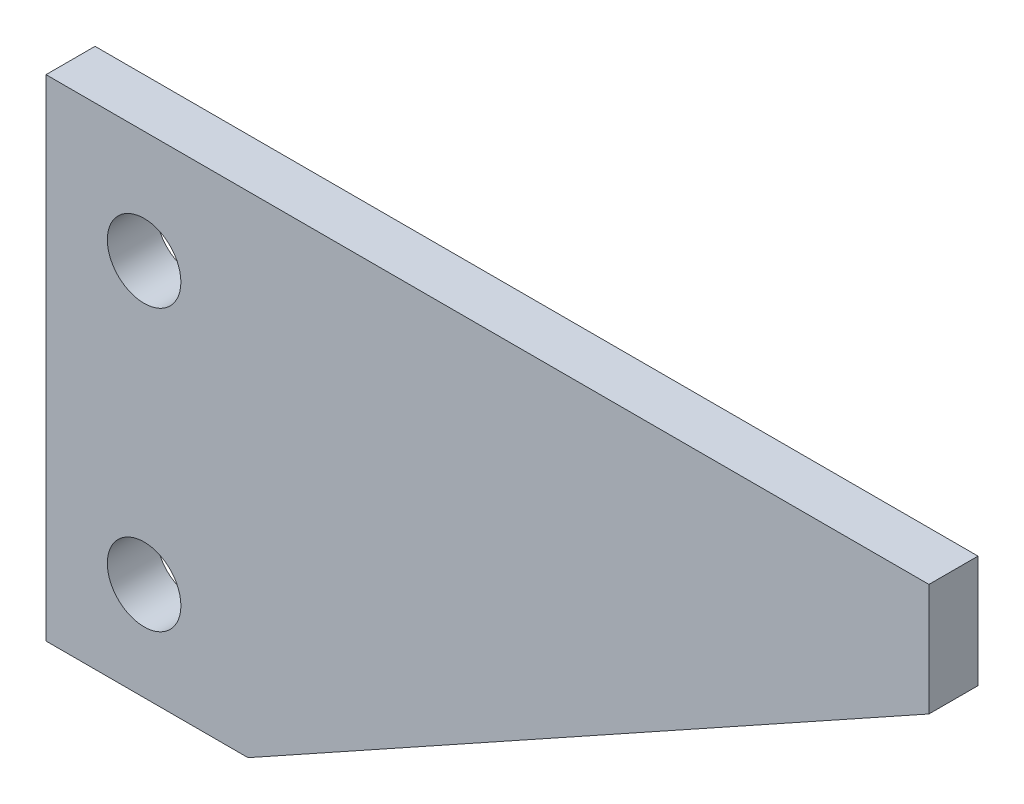
ISO-10303-21;
HEADER;
FILE_DESCRIPTION(('STEP AP214'),'2;1');
FILE_NAME('part.step','',(''),(''),'','','');
FILE_SCHEMA(('AUTOMOTIVE_DESIGN { 1 0 10303 214 1 1 1 1 }'));
ENDSEC;
DATA;
#1=APPLICATION_CONTEXT('core data for automotive mechanical design processes');
#2=APPLICATION_PROTOCOL_DEFINITION('international standard','automotive_design',2000,#1);
#3=PRODUCT_CONTEXT('',#1,'mechanical');
#4=PRODUCT('Part','Part','',(#3));
#5=PRODUCT_RELATED_PRODUCT_CATEGORY('part','',(#4));
#6=PRODUCT_DEFINITION_FORMATION('','',#4);
#7=PRODUCT_DEFINITION_CONTEXT('part definition',#1,'design');
#8=PRODUCT_DEFINITION('design','',#6,#7);
#9=PRODUCT_DEFINITION_SHAPE('','',#8);
#10=(LENGTH_UNIT() NAMED_UNIT(*) SI_UNIT(.MILLI.,.METRE.));
#11=(NAMED_UNIT(*) PLANE_ANGLE_UNIT() SI_UNIT($,.RADIAN.));
#12=(NAMED_UNIT(*) SI_UNIT($,.STERADIAN.) SOLID_ANGLE_UNIT());
#13=UNCERTAINTY_MEASURE_WITH_UNIT(LENGTH_MEASURE(1.E-05),#10,'distance_accuracy_value','');
#14=(GEOMETRIC_REPRESENTATION_CONTEXT(3) GLOBAL_UNCERTAINTY_ASSIGNED_CONTEXT((#13)) GLOBAL_UNIT_ASSIGNED_CONTEXT((#10,
#11,#12)) REPRESENTATION_CONTEXT('',''));
#15=CARTESIAN_POINT('',(0.,0.,0.));
#16=DIRECTION('',(0.,0.,1.));
#17=DIRECTION('',(1.,0.,0.));
#18=AXIS2_PLACEMENT_3D('',#15,#16,#17);
#19=CARTESIAN_POINT('',(90.,27.1208219090685,-5.));
#20=DIRECTION('',(1.,0.,0.));
#21=DIRECTION('',(0.,0.,-1.));
#22=AXIS2_PLACEMENT_3D('',#19,#20,#21);
#23=PLANE('',#22);
#24=DIRECTION('',(0.,0.,1.));
#25=VECTOR('',#24,1.);
#26=CARTESIAN_POINT('',(90.,50.,-5.));
#27=LINE('',#26,#25);
#28=CARTESIAN_POINT('',(90.,50.,-5.));
#29=VERTEX_POINT('',#28);
#30=CARTESIAN_POINT('',(90.,50.,5.));
#31=VERTEX_POINT('',#30);
#32=EDGE_CURVE('E41',#29,#31,#27,.T.);
#33=ORIENTED_EDGE('',*,*,#32,.T.);
#34=DIRECTION('',(0.,1.,0.));
#35=VECTOR('',#34,1.);
#36=CARTESIAN_POINT('',(90.,27.1208219090685,5.));
#37=LINE('',#36,#35);
#38=CARTESIAN_POINT('',(90.,27.1208219090685,5.));
#39=VERTEX_POINT('',#38);
#40=EDGE_CURVE('E84',#39,#31,#37,.T.);
#41=ORIENTED_EDGE('',*,*,#40,.F.);
#42=DIRECTION('',(0.,0.,1.));
#43=VECTOR('',#42,1.);
#44=CARTESIAN_POINT('',(90.,27.1208219090685,-5.));
#45=LINE('',#44,#43);
#46=CARTESIAN_POINT('',(90.,27.1208219090685,-5.));
#47=VERTEX_POINT('',#46);
#48=EDGE_CURVE('E11',#47,#39,#45,.T.);
#49=ORIENTED_EDGE('',*,*,#48,.F.);
#50=DIRECTION('',(0.,1.,0.));
#51=VECTOR('',#50,1.);
#52=CARTESIAN_POINT('',(90.,27.1208219090685,-5.));
#53=LINE('',#52,#51);
#54=EDGE_CURVE('E85',#47,#29,#53,.T.);
#55=ORIENTED_EDGE('',*,*,#54,.T.);
#56=EDGE_LOOP('',(#33,#41,#49,#55));
#57=FACE_BOUND('',#56,.T.);
#58=ADVANCED_FACE('F38',(#57),#23,.T.);
#59=CARTESIAN_POINT('',(-48.8174794358542,-49.9999999999488,-5.));
#60=DIRECTION('',(0.48564293117964,-0.874157276120978,0.));
#61=DIRECTION('',(0.874157276120978,0.48564293117964,0.));
#62=AXIS2_PLACEMENT_3D('',#59,#60,#61);
#63=PLANE('',#62);
#64=ORIENTED_EDGE('',*,*,#48,.T.);
#65=DIRECTION('',(0.874157276120978,0.48564293117964,0.));
#66=VECTOR('',#65,1.);
#67=CARTESIAN_POINT('',(-48.8174794358542,-49.9999999999488,5.));
#68=LINE('',#67,#66);
#69=CARTESIAN_POINT('',(-48.8174794358542,-49.9999999999488,5.));
#70=VERTEX_POINT('',#69);
#71=EDGE_CURVE('E103',#70,#39,#68,.T.);
#72=ORIENTED_EDGE('',*,*,#71,.F.);
#73=DIRECTION('',(0.,0.,1.));
#74=VECTOR('',#73,1.);
#75=CARTESIAN_POINT('',(-48.8174794358542,-49.9999999999488,-5.));
#76=LINE('',#75,#74);
#77=CARTESIAN_POINT('',(-48.8174794358542,-49.9999999999488,-5.));
#78=VERTEX_POINT('',#77);
#79=EDGE_CURVE('E46',#78,#70,#76,.T.);
#80=ORIENTED_EDGE('',*,*,#79,.F.);
#81=DIRECTION('',(0.874157276120978,0.48564293117964,0.));
#82=VECTOR('',#81,1.);
#83=CARTESIAN_POINT('',(-48.8174794358542,-49.9999999999488,-5.));
#84=LINE('',#83,#82);
#85=EDGE_CURVE('E90',#78,#47,#84,.T.);
#86=ORIENTED_EDGE('',*,*,#85,.T.);
#87=EDGE_LOOP('',(#64,#72,#80,#86));
#88=FACE_BOUND('',#87,.T.);
#89=ADVANCED_FACE('F142',(#88),#63,.T.);
#90=CARTESIAN_POINT('',(-90.,-50.,-5.));
#91=DIRECTION('',(1.24228590316177E-12,-1.,0.));
#92=DIRECTION('',(1.,1.24228590316177E-12,0.));
#93=AXIS2_PLACEMENT_3D('',#90,#91,#92);
#94=PLANE('',#93);
#95=ORIENTED_EDGE('',*,*,#79,.T.);
#96=DIRECTION('',(1.,1.24228590316177E-12,0.));
#97=VECTOR('',#96,1.);
#98=CARTESIAN_POINT('',(-90.,-50.,5.));
#99=LINE('',#98,#97);
#100=CARTESIAN_POINT('',(-90.,-50.,5.));
#101=VERTEX_POINT('',#100);
#102=EDGE_CURVE('E112',#101,#70,#99,.T.);
#103=ORIENTED_EDGE('',*,*,#102,.F.);
#104=DIRECTION('',(0.,0.,1.));
#105=VECTOR('',#104,1.);
#106=CARTESIAN_POINT('',(-90.,-50.,-5.));
#107=LINE('',#106,#105);
#108=CARTESIAN_POINT('',(-90.,-50.,-5.));
#109=VERTEX_POINT('',#108);
#110=EDGE_CURVE('E131',#109,#101,#107,.T.);
#111=ORIENTED_EDGE('',*,*,#110,.F.);
#112=DIRECTION('',(1.,1.24228590316177E-12,0.));
#113=VECTOR('',#112,1.);
#114=CARTESIAN_POINT('',(-90.,-50.,-5.));
#115=LINE('',#114,#113);
#116=EDGE_CURVE('E127',#109,#78,#115,.T.);
#117=ORIENTED_EDGE('',*,*,#116,.T.);
#118=EDGE_LOOP('',(#95,#103,#111,#117));
#119=FACE_BOUND('',#118,.T.);
#120=ADVANCED_FACE('F138',(#119),#94,.T.);
#121=CARTESIAN_POINT('',(-90.,-50.,-5.));
#122=DIRECTION('',(-1.,0.,0.));
#123=DIRECTION('',(0.,0.,1.));
#124=AXIS2_PLACEMENT_3D('',#121,#122,#123);
#125=PLANE('',#124);
#126=ORIENTED_EDGE('',*,*,#110,.T.);
#127=DIRECTION('',(0.,-1.,0.));
#128=VECTOR('',#127,1.);
#129=CARTESIAN_POINT('',(-90.,-50.,5.));
#130=LINE('',#129,#128);
#131=CARTESIAN_POINT('',(-90.,50.,5.));
#132=VERTEX_POINT('',#131);
#133=EDGE_CURVE('E97',#132,#101,#130,.T.);
#134=ORIENTED_EDGE('',*,*,#133,.F.);
#135=DIRECTION('',(0.,0.,1.));
#136=VECTOR('',#135,1.);
#137=CARTESIAN_POINT('',(-90.,50.,-5.));
#138=LINE('',#137,#136);
#139=CARTESIAN_POINT('',(-90.,50.,-5.));
#140=VERTEX_POINT('',#139);
#141=EDGE_CURVE('E89',#140,#132,#138,.T.);
#142=ORIENTED_EDGE('',*,*,#141,.F.);
#143=DIRECTION('',(0.,-1.,0.));
#144=VECTOR('',#143,1.);
#145=CARTESIAN_POINT('',(-90.,-50.,-5.));
#146=LINE('',#145,#144);
#147=EDGE_CURVE('E124',#140,#109,#146,.T.);
#148=ORIENTED_EDGE('',*,*,#147,.T.);
#149=EDGE_LOOP('',(#126,#134,#142,#148));
#150=FACE_BOUND('',#149,.T.);
#151=ADVANCED_FACE('F133',(#150),#125,.T.);
#152=CARTESIAN_POINT('',(-90.,50.,-5.));
#153=DIRECTION('',(0.,1.,0.));
#154=DIRECTION('',(0.,0.,1.));
#155=AXIS2_PLACEMENT_3D('',#152,#153,#154);
#156=PLANE('',#155);
#157=ORIENTED_EDGE('',*,*,#141,.T.);
#158=DIRECTION('',(-1.,0.,0.));
#159=VECTOR('',#158,1.);
#160=CARTESIAN_POINT('',(-90.,50.,5.));
#161=LINE('',#160,#159);
#162=EDGE_CURVE('E92',#31,#132,#161,.T.);
#163=ORIENTED_EDGE('',*,*,#162,.F.);
#164=ORIENTED_EDGE('',*,*,#32,.F.);
#165=DIRECTION('',(-1.,0.,0.));
#166=VECTOR('',#165,1.);
#167=CARTESIAN_POINT('',(-90.,50.,-5.));
#168=LINE('',#167,#166);
#169=EDGE_CURVE('E122',#29,#140,#168,.T.);
#170=ORIENTED_EDGE('',*,*,#169,.T.);
#171=EDGE_LOOP('',(#157,#163,#164,#170));
#172=FACE_BOUND('',#171,.T.);
#173=ADVANCED_FACE('F93',(#172),#156,.T.);
#174=CARTESIAN_POINT('',(0.,0.,-5.));
#175=DIRECTION('',(0.,0.,-1.));
#176=DIRECTION('',(-1.,0.,0.));
#177=AXIS2_PLACEMENT_3D('',#174,#175,#176);
#178=PLANE('',#177);
#179=CARTESIAN_POINT('',(-70.,-30.,-5.));
#180=DIRECTION('',(0.,0.,1.));
#181=DIRECTION('',(1.,0.,0.));
#182=AXIS2_PLACEMENT_3D('',#179,#180,#181);
#183=CIRCLE('',#182,7.5);
#184=CARTESIAN_POINT('',(-62.5,-30.,-5.));
#185=VERTEX_POINT('',#184);
#186=EDGE_CURVE('E115',#185,#185,#183,.T.);
#187=ORIENTED_EDGE('',*,*,#186,.T.);
#188=EDGE_LOOP('',(#187));
#189=FACE_BOUND('',#188,.T.);
#190=CARTESIAN_POINT('',(-70.,27.1208219091061,-5.));
#191=DIRECTION('',(0.,0.,1.));
#192=DIRECTION('',(1.,0.,0.));
#193=AXIS2_PLACEMENT_3D('',#190,#191,#192);
#194=CIRCLE('',#193,7.5);
#195=CARTESIAN_POINT('',(-62.5,27.1208219091061,-5.));
#196=VERTEX_POINT('',#195);
#197=EDGE_CURVE('E118',#196,#196,#194,.T.);
#198=ORIENTED_EDGE('',*,*,#197,.T.);
#199=EDGE_LOOP('',(#198));
#200=FACE_BOUND('',#199,.T.);
#201=ORIENTED_EDGE('',*,*,#54,.F.);
#202=ORIENTED_EDGE('',*,*,#85,.F.);
#203=ORIENTED_EDGE('',*,*,#116,.F.);
#204=ORIENTED_EDGE('',*,*,#147,.F.);
#205=ORIENTED_EDGE('',*,*,#169,.F.);
#206=EDGE_LOOP('',(#201,#202,#203,#204,#205));
#207=FACE_BOUND('',#206,.T.);
#208=ADVANCED_FACE('F141',(#189,#200,#207),#178,.T.);
#209=CARTESIAN_POINT('',(-70.,27.1208219091061,-5.));
#210=DIRECTION('',(0.,0.,1.));
#211=DIRECTION('',(1.,0.,0.));
#212=AXIS2_PLACEMENT_3D('',#209,#210,#211);
#213=CYLINDRICAL_SURFACE('',#212,7.5);
#214=ORIENTED_EDGE('',*,*,#197,.F.);
#215=EDGE_LOOP('',(#214));
#216=FACE_BOUND('',#215,.T.);
#217=CARTESIAN_POINT('',(-70.,27.1208219091061,5.));
#218=DIRECTION('',(0.,0.,1.));
#219=DIRECTION('',(1.,0.,0.));
#220=AXIS2_PLACEMENT_3D('',#217,#218,#219);
#221=CIRCLE('',#220,7.5);
#222=CARTESIAN_POINT('',(-62.5,27.1208219091061,5.));
#223=VERTEX_POINT('',#222);
#224=EDGE_CURVE('E104',#223,#223,#221,.T.);
#225=ORIENTED_EDGE('',*,*,#224,.T.);
#226=EDGE_LOOP('',(#225));
#227=FACE_BOUND('',#226,.T.);
#228=ADVANCED_FACE('F158',(#216,#227),#213,.F.);
#229=CARTESIAN_POINT('',(-70.,-30.,-5.));
#230=DIRECTION('',(0.,0.,1.));
#231=DIRECTION('',(1.,0.,0.));
#232=AXIS2_PLACEMENT_3D('',#229,#230,#231);
#233=CYLINDRICAL_SURFACE('',#232,7.5);
#234=ORIENTED_EDGE('',*,*,#186,.F.);
#235=EDGE_LOOP('',(#234));
#236=FACE_BOUND('',#235,.T.);
#237=CARTESIAN_POINT('',(-70.,-30.,5.));
#238=DIRECTION('',(0.,0.,1.));
#239=DIRECTION('',(1.,0.,0.));
#240=AXIS2_PLACEMENT_3D('',#237,#238,#239);
#241=CIRCLE('',#240,7.5);
#242=CARTESIAN_POINT('',(-62.5,-30.,5.));
#243=VERTEX_POINT('',#242);
#244=EDGE_CURVE('E107',#243,#243,#241,.T.);
#245=ORIENTED_EDGE('',*,*,#244,.T.);
#246=EDGE_LOOP('',(#245));
#247=FACE_BOUND('',#246,.T.);
#248=ADVANCED_FACE('F163',(#236,#247),#233,.F.);
#249=CARTESIAN_POINT('',(0.,0.,5.));
#250=DIRECTION('',(0.,0.,-1.));
#251=DIRECTION('',(-1.,0.,0.));
#252=AXIS2_PLACEMENT_3D('',#249,#250,#251);
#253=PLANE('',#252);
#254=ORIENTED_EDGE('',*,*,#40,.T.);
#255=ORIENTED_EDGE('',*,*,#162,.T.);
#256=ORIENTED_EDGE('',*,*,#133,.T.);
#257=ORIENTED_EDGE('',*,*,#102,.T.);
#258=ORIENTED_EDGE('',*,*,#71,.T.);
#259=EDGE_LOOP('',(#254,#255,#256,#257,#258));
#260=FACE_BOUND('',#259,.T.);
#261=ORIENTED_EDGE('',*,*,#224,.F.);
#262=EDGE_LOOP('',(#261));
#263=FACE_BOUND('',#262,.T.);
#264=ORIENTED_EDGE('',*,*,#244,.F.);
#265=EDGE_LOOP('',(#264));
#266=FACE_BOUND('',#265,.T.);
#267=ADVANCED_FACE('F100',(#260,#263,#266),#253,.F.);
#268=CLOSED_SHELL('',(#58,#89,#120,#151,#173,#208,#228,#248,#267));
#269=MANIFOLD_SOLID_BREP('B2',#268);
#270=ADVANCED_BREP_SHAPE_REPRESENTATION('',(#18,#269),#14);
#271=SHAPE_DEFINITION_REPRESENTATION(#9,#270);
ENDSEC;
END-ISO-10303-21;
